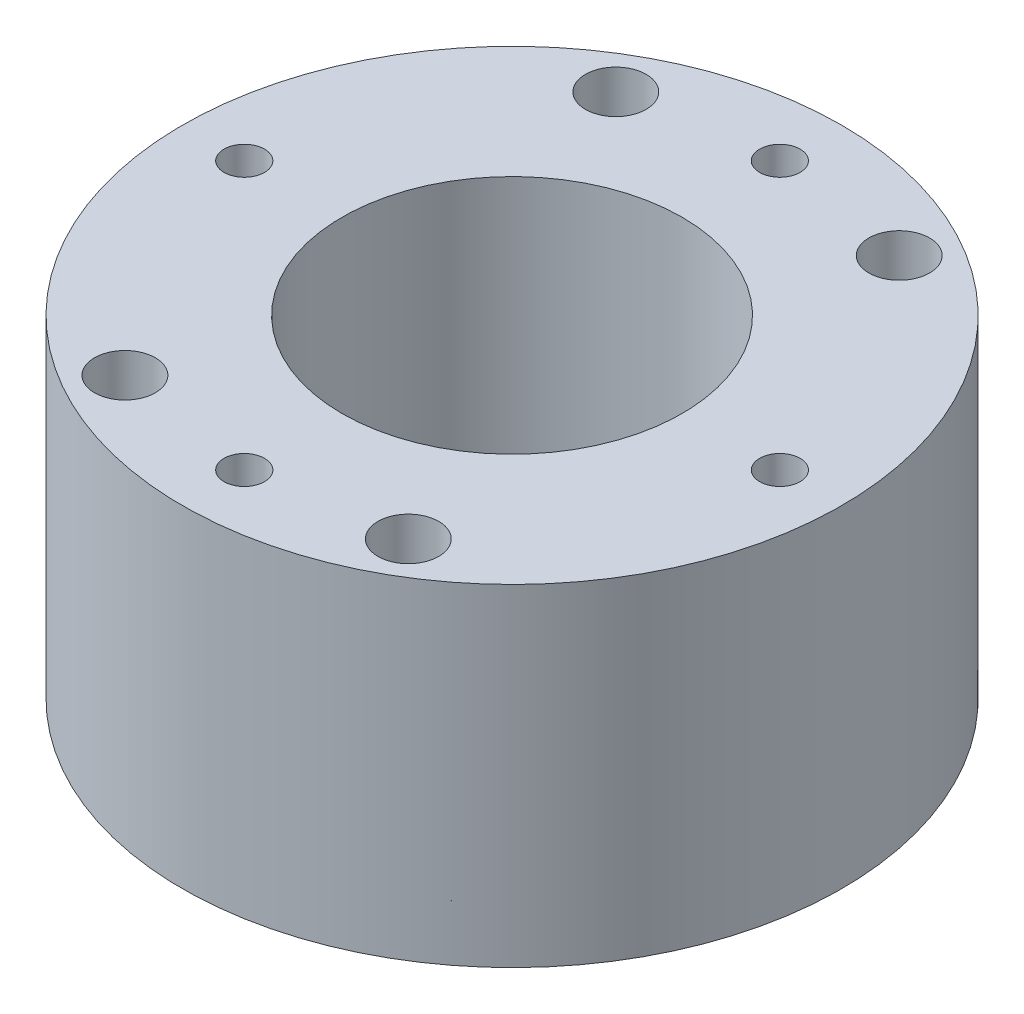
ISO-10303-21;
HEADER;
FILE_DESCRIPTION(('STEP AP214'),'2;1');
FILE_NAME('part.step','',(''),(''),'','','');
FILE_SCHEMA(('AUTOMOTIVE_DESIGN { 1 0 10303 214 1 1 1 1 }'));
ENDSEC;
DATA;
#1=APPLICATION_CONTEXT('core data for automotive mechanical design processes');
#2=APPLICATION_PROTOCOL_DEFINITION('international standard','automotive_design',2000,#1);
#3=PRODUCT_CONTEXT('',#1,'mechanical');
#4=PRODUCT('Part','Part','',(#3));
#5=PRODUCT_RELATED_PRODUCT_CATEGORY('part','',(#4));
#6=PRODUCT_DEFINITION_FORMATION('','',#4);
#7=PRODUCT_DEFINITION_CONTEXT('part definition',#1,'design');
#8=PRODUCT_DEFINITION('design','',#6,#7);
#9=PRODUCT_DEFINITION_SHAPE('','',#8);
#10=(LENGTH_UNIT() NAMED_UNIT(*) SI_UNIT(.MILLI.,.METRE.));
#11=(NAMED_UNIT(*) PLANE_ANGLE_UNIT() SI_UNIT($,.RADIAN.));
#12=(NAMED_UNIT(*) SI_UNIT($,.STERADIAN.) SOLID_ANGLE_UNIT());
#13=UNCERTAINTY_MEASURE_WITH_UNIT(LENGTH_MEASURE(1.E-05),#10,'distance_accuracy_value','');
#14=(GEOMETRIC_REPRESENTATION_CONTEXT(3) GLOBAL_UNCERTAINTY_ASSIGNED_CONTEXT((#13)) GLOBAL_UNIT_ASSIGNED_CONTEXT((#10,
#11,#12)) REPRESENTATION_CONTEXT('',''));
#15=CARTESIAN_POINT('',(0.,0.,0.));
#16=DIRECTION('',(0.,0.,1.));
#17=DIRECTION('',(1.,0.,0.));
#18=AXIS2_PLACEMENT_3D('',#15,#16,#17);
#19=CARTESIAN_POINT('',(0.,0.,0.));
#20=DIRECTION('',(0.,-1.,0.));
#21=DIRECTION('',(0.,0.,-1.));
#22=AXIS2_PLACEMENT_3D('',#19,#20,#21);
#23=CYLINDRICAL_SURFACE('',#22,14.2875);
#24=CARTESIAN_POINT('',(0.,0.,0.));
#25=DIRECTION('',(0.,-1.,0.));
#26=DIRECTION('',(0.,0.,-1.));
#27=AXIS2_PLACEMENT_3D('',#24,#25,#26);
#28=CIRCLE('',#27,14.2875);
#29=CARTESIAN_POINT('',(0.,0.,-14.2875));
#30=VERTEX_POINT('',#29);
#31=EDGE_CURVE('E60',#30,#30,#28,.T.);
#32=ORIENTED_EDGE('',*,*,#31,.T.);
#33=EDGE_LOOP('',(#32));
#34=FACE_BOUND('',#33,.T.);
#35=CARTESIAN_POINT('',(0.,27.8791,0.));
#36=DIRECTION('',(0.,-1.,0.));
#37=DIRECTION('',(0.,0.,-1.));
#38=AXIS2_PLACEMENT_3D('',#35,#36,#37);
#39=CIRCLE('',#38,14.2875);
#40=CARTESIAN_POINT('',(0.,27.8791,-14.2875));
#41=VERTEX_POINT('',#40);
#42=EDGE_CURVE('E10',#41,#41,#39,.T.);
#43=ORIENTED_EDGE('',*,*,#42,.F.);
#44=EDGE_LOOP('',(#43));
#45=FACE_BOUND('',#44,.T.);
#46=ADVANCED_FACE('F43',(#34,#45),#23,.F.);
#47=CARTESIAN_POINT('',(14.2875,27.8791,0.));
#48=DIRECTION('',(0.,1.,0.));
#49=DIRECTION('',(0.,0.,1.));
#50=AXIS2_PLACEMENT_3D('',#47,#48,#49);
#51=PLANE('',#50);
#52=CARTESIAN_POINT('',(-11.90625,27.8791,-20.6222299276169));
#53=DIRECTION('',(0.,1.,0.));
#54=DIRECTION('',(0.,0.,1.));
#55=AXIS2_PLACEMENT_3D('',#52,#53,#54);
#56=CIRCLE('',#55,2.55269999999999);
#57=CARTESIAN_POINT('',(-11.90625,27.8791,-18.069529927617));
#58=VERTEX_POINT('',#57);
#59=EDGE_CURVE('E154',#58,#58,#56,.T.);
#60=ORIENTED_EDGE('',*,*,#59,.F.);
#61=EDGE_LOOP('',(#60));
#62=FACE_BOUND('',#61,.T.);
#63=CARTESIAN_POINT('',(11.90625,27.8791,-20.6222299276169));
#64=DIRECTION('',(0.,1.,0.));
#65=DIRECTION('',(0.,0.,1.));
#66=AXIS2_PLACEMENT_3D('',#63,#64,#65);
#67=CIRCLE('',#66,2.5527);
#68=CARTESIAN_POINT('',(11.90625,27.8791,-18.069529927617));
#69=VERTEX_POINT('',#68);
#70=EDGE_CURVE('E146',#69,#69,#67,.T.);
#71=ORIENTED_EDGE('',*,*,#70,.F.);
#72=EDGE_LOOP('',(#71));
#73=FACE_BOUND('',#72,.T.);
#74=CARTESIAN_POINT('',(11.90625,27.8791,20.6222299276169));
#75=DIRECTION('',(0.,1.,0.));
#76=DIRECTION('',(0.,0.,1.));
#77=AXIS2_PLACEMENT_3D('',#74,#75,#76);
#78=CIRCLE('',#77,2.5527);
#79=CARTESIAN_POINT('',(11.90625,27.8791,23.1749299276169));
#80=VERTEX_POINT('',#79);
#81=EDGE_CURVE('E138',#80,#80,#78,.T.);
#82=ORIENTED_EDGE('',*,*,#81,.F.);
#83=EDGE_LOOP('',(#82));
#84=FACE_BOUND('',#83,.T.);
#85=CARTESIAN_POINT('',(-11.90625,27.8791,20.622229927617));
#86=DIRECTION('',(0.,1.,0.));
#87=DIRECTION('',(0.,0.,1.));
#88=AXIS2_PLACEMENT_3D('',#85,#86,#87);
#89=CIRCLE('',#88,2.5527);
#90=CARTESIAN_POINT('',(-11.90625,27.8791,23.174929927617));
#91=VERTEX_POINT('',#90);
#92=EDGE_CURVE('E130',#91,#91,#89,.T.);
#93=ORIENTED_EDGE('',*,*,#92,.F.);
#94=EDGE_LOOP('',(#93));
#95=FACE_BOUND('',#94,.T.);
#96=CARTESIAN_POINT('',(0.,27.8791,-22.5));
#97=DIRECTION('',(0.,1.,0.));
#98=DIRECTION('',(0.,0.,1.));
#99=AXIS2_PLACEMENT_3D('',#96,#97,#98);
#100=CIRCLE('',#99,1.7);
#101=CARTESIAN_POINT('',(0.,27.8791,-20.8));
#102=VERTEX_POINT('',#101);
#103=EDGE_CURVE('E114',#102,#102,#100,.T.);
#104=ORIENTED_EDGE('',*,*,#103,.F.);
#105=EDGE_LOOP('',(#104));
#106=FACE_BOUND('',#105,.T.);
#107=CARTESIAN_POINT('',(22.5,27.8791,0.));
#108=DIRECTION('',(0.,1.,0.));
#109=DIRECTION('',(0.,0.,1.));
#110=AXIS2_PLACEMENT_3D('',#107,#108,#109);
#111=CIRCLE('',#110,1.7);
#112=CARTESIAN_POINT('',(22.5,27.8791,1.7));
#113=VERTEX_POINT('',#112);
#114=EDGE_CURVE('E98',#113,#113,#111,.T.);
#115=ORIENTED_EDGE('',*,*,#114,.F.);
#116=EDGE_LOOP('',(#115));
#117=FACE_BOUND('',#116,.T.);
#118=CARTESIAN_POINT('',(-22.5,27.8791,0.));
#119=DIRECTION('',(0.,1.,0.));
#120=DIRECTION('',(0.,0.,1.));
#121=AXIS2_PLACEMENT_3D('',#118,#119,#120);
#122=CIRCLE('',#121,1.7);
#123=CARTESIAN_POINT('',(-22.5,27.8791,1.7));
#124=VERTEX_POINT('',#123);
#125=EDGE_CURVE('E82',#124,#124,#122,.T.);
#126=ORIENTED_EDGE('',*,*,#125,.F.);
#127=EDGE_LOOP('',(#126));
#128=FACE_BOUND('',#127,.T.);
#129=CARTESIAN_POINT('',(0.,27.8791,22.5));
#130=DIRECTION('',(0.,1.,0.));
#131=DIRECTION('',(0.,0.,1.));
#132=AXIS2_PLACEMENT_3D('',#129,#130,#131);
#133=CIRCLE('',#132,1.7);
#134=CARTESIAN_POINT('',(0.,27.8791,24.2));
#135=VERTEX_POINT('',#134);
#136=EDGE_CURVE('E66',#135,#135,#133,.T.);
#137=ORIENTED_EDGE('',*,*,#136,.F.);
#138=EDGE_LOOP('',(#137));
#139=FACE_BOUND('',#138,.T.);
#140=ORIENTED_EDGE('',*,*,#42,.T.);
#141=EDGE_LOOP('',(#140));
#142=FACE_BOUND('',#141,.T.);
#143=CARTESIAN_POINT('',(0.,27.8791,0.));
#144=DIRECTION('',(0.,-1.,0.));
#145=DIRECTION('',(0.,0.,-1.));
#146=AXIS2_PLACEMENT_3D('',#143,#144,#145);
#147=CIRCLE('',#146,27.69);
#148=CARTESIAN_POINT('',(0.,27.8791,-27.69));
#149=VERTEX_POINT('',#148);
#150=EDGE_CURVE('E50',#149,#149,#147,.T.);
#151=ORIENTED_EDGE('',*,*,#150,.F.);
#152=EDGE_LOOP('',(#151));
#153=FACE_BOUND('',#152,.T.);
#154=ADVANCED_FACE('F192',(#62,#73,#84,#95,#106,#117,#128,#139,#142,#153),#51,.T.);
#155=CARTESIAN_POINT('',(0.,0.,0.));
#156=DIRECTION('',(0.,-1.,0.));
#157=DIRECTION('',(0.,0.,-1.));
#158=AXIS2_PLACEMENT_3D('',#155,#156,#157);
#159=CYLINDRICAL_SURFACE('',#158,27.69);
#160=ORIENTED_EDGE('',*,*,#150,.T.);
#161=EDGE_LOOP('',(#160));
#162=FACE_BOUND('',#161,.T.);
#163=CARTESIAN_POINT('',(0.,0.,0.));
#164=DIRECTION('',(0.,-1.,0.));
#165=DIRECTION('',(0.,0.,-1.));
#166=AXIS2_PLACEMENT_3D('',#163,#164,#165);
#167=CIRCLE('',#166,27.69);
#168=CARTESIAN_POINT('',(0.,0.,-27.69));
#169=VERTEX_POINT('',#168);
#170=EDGE_CURVE('E55',#169,#169,#167,.T.);
#171=ORIENTED_EDGE('',*,*,#170,.F.);
#172=EDGE_LOOP('',(#171));
#173=FACE_BOUND('',#172,.T.);
#174=ADVANCED_FACE('F170',(#162,#173),#159,.T.);
#175=CARTESIAN_POINT('',(27.69,0.,0.));
#176=DIRECTION('',(0.,-1.,0.));
#177=DIRECTION('',(0.,0.,-1.));
#178=AXIS2_PLACEMENT_3D('',#175,#176,#177);
#179=PLANE('',#178);
#180=CARTESIAN_POINT('',(-11.90625,0.,-20.6222299276169));
#181=DIRECTION('',(0.,-1.,0.));
#182=DIRECTION('',(0.,0.,-1.));
#183=AXIS2_PLACEMENT_3D('',#180,#181,#182);
#184=CIRCLE('',#183,2.5527);
#185=CARTESIAN_POINT('',(-11.90625,0.,-23.1749299276169));
#186=VERTEX_POINT('',#185);
#187=EDGE_CURVE('E158',#186,#186,#184,.T.);
#188=ORIENTED_EDGE('',*,*,#187,.F.);
#189=EDGE_LOOP('',(#188));
#190=FACE_BOUND('',#189,.T.);
#191=CARTESIAN_POINT('',(11.90625,0.,-20.6222299276169));
#192=DIRECTION('',(0.,-1.,0.));
#193=DIRECTION('',(0.,0.,-1.));
#194=AXIS2_PLACEMENT_3D('',#191,#192,#193);
#195=CIRCLE('',#194,2.5527);
#196=CARTESIAN_POINT('',(11.90625,0.,-23.1749299276169));
#197=VERTEX_POINT('',#196);
#198=EDGE_CURVE('E150',#197,#197,#195,.T.);
#199=ORIENTED_EDGE('',*,*,#198,.F.);
#200=EDGE_LOOP('',(#199));
#201=FACE_BOUND('',#200,.T.);
#202=CARTESIAN_POINT('',(11.90625,0.,20.6222299276169));
#203=DIRECTION('',(0.,-1.,0.));
#204=DIRECTION('',(0.,0.,-1.));
#205=AXIS2_PLACEMENT_3D('',#202,#203,#204);
#206=CIRCLE('',#205,2.5527);
#207=CARTESIAN_POINT('',(11.90625,0.,18.0695299276169));
#208=VERTEX_POINT('',#207);
#209=EDGE_CURVE('E142',#208,#208,#206,.T.);
#210=ORIENTED_EDGE('',*,*,#209,.F.);
#211=EDGE_LOOP('',(#210));
#212=FACE_BOUND('',#211,.T.);
#213=CARTESIAN_POINT('',(-11.90625,0.,20.622229927617));
#214=DIRECTION('',(0.,-1.,0.));
#215=DIRECTION('',(0.,0.,-1.));
#216=AXIS2_PLACEMENT_3D('',#213,#214,#215);
#217=CIRCLE('',#216,2.5527);
#218=CARTESIAN_POINT('',(-11.90625,0.,18.069529927617));
#219=VERTEX_POINT('',#218);
#220=EDGE_CURVE('E134',#219,#219,#217,.T.);
#221=ORIENTED_EDGE('',*,*,#220,.F.);
#222=EDGE_LOOP('',(#221));
#223=FACE_BOUND('',#222,.T.);
#224=CARTESIAN_POINT('',(0.,0.,-22.5));
#225=DIRECTION('',(0.,-1.,0.));
#226=DIRECTION('',(0.,0.,-1.));
#227=AXIS2_PLACEMENT_3D('',#224,#225,#226);
#228=CIRCLE('',#227,3.35);
#229=CARTESIAN_POINT('',(0.,0.,-25.85));
#230=VERTEX_POINT('',#229);
#231=EDGE_CURVE('E126',#230,#230,#228,.T.);
#232=ORIENTED_EDGE('',*,*,#231,.F.);
#233=EDGE_LOOP('',(#232));
#234=FACE_BOUND('',#233,.T.);
#235=CARTESIAN_POINT('',(22.5,0.,0.));
#236=DIRECTION('',(0.,-1.,0.));
#237=DIRECTION('',(0.,0.,-1.));
#238=AXIS2_PLACEMENT_3D('',#235,#236,#237);
#239=CIRCLE('',#238,3.35);
#240=CARTESIAN_POINT('',(22.5,0.,-3.35));
#241=VERTEX_POINT('',#240);
#242=EDGE_CURVE('E110',#241,#241,#239,.T.);
#243=ORIENTED_EDGE('',*,*,#242,.F.);
#244=EDGE_LOOP('',(#243));
#245=FACE_BOUND('',#244,.T.);
#246=CARTESIAN_POINT('',(-22.5,0.,0.));
#247=DIRECTION('',(0.,-1.,0.));
#248=DIRECTION('',(0.,0.,-1.));
#249=AXIS2_PLACEMENT_3D('',#246,#247,#248);
#250=CIRCLE('',#249,3.35);
#251=CARTESIAN_POINT('',(-22.5,0.,-3.35));
#252=VERTEX_POINT('',#251);
#253=EDGE_CURVE('E94',#252,#252,#250,.T.);
#254=ORIENTED_EDGE('',*,*,#253,.F.);
#255=EDGE_LOOP('',(#254));
#256=FACE_BOUND('',#255,.T.);
#257=CARTESIAN_POINT('',(0.,0.,22.5));
#258=DIRECTION('',(0.,-1.,0.));
#259=DIRECTION('',(0.,0.,-1.));
#260=AXIS2_PLACEMENT_3D('',#257,#258,#259);
#261=CIRCLE('',#260,3.35);
#262=CARTESIAN_POINT('',(0.,0.,19.15));
#263=VERTEX_POINT('',#262);
#264=EDGE_CURVE('E78',#263,#263,#261,.T.);
#265=ORIENTED_EDGE('',*,*,#264,.F.);
#266=EDGE_LOOP('',(#265));
#267=FACE_BOUND('',#266,.T.);
#268=ORIENTED_EDGE('',*,*,#170,.T.);
#269=EDGE_LOOP('',(#268));
#270=FACE_BOUND('',#269,.T.);
#271=ORIENTED_EDGE('',*,*,#31,.F.);
#272=EDGE_LOOP('',(#271));
#273=FACE_BOUND('',#272,.T.);
#274=ADVANCED_FACE('F166',(#190,#201,#212,#223,#234,#245,#256,#267,#270,#273),#179,.T.);
#275=CARTESIAN_POINT('',(0.,0.,22.5));
#276=DIRECTION('',(0.,-1.,0.));
#277=DIRECTION('',(0.,0.,-1.));
#278=AXIS2_PLACEMENT_3D('',#275,#276,#277);
#279=CYLINDRICAL_SURFACE('',#278,1.7);
#280=CARTESIAN_POINT('',(0.,2.15,22.5));
#281=DIRECTION('',(0.,-1.,0.));
#282=DIRECTION('',(0.,0.,-1.));
#283=AXIS2_PLACEMENT_3D('',#280,#281,#282);
#284=CIRCLE('',#283,1.7);
#285=CARTESIAN_POINT('',(0.,2.15,20.8));
#286=VERTEX_POINT('',#285);
#287=EDGE_CURVE('E70',#286,#286,#284,.T.);
#288=ORIENTED_EDGE('',*,*,#287,.T.);
#289=EDGE_LOOP('',(#288));
#290=FACE_BOUND('',#289,.T.);
#291=ORIENTED_EDGE('',*,*,#136,.T.);
#292=EDGE_LOOP('',(#291));
#293=FACE_BOUND('',#292,.T.);
#294=ADVANCED_FACE('F169',(#290,#293),#279,.F.);
#295=CARTESIAN_POINT('',(1.7,2.15,22.5));
#296=DIRECTION('',(0.,1.,0.));
#297=DIRECTION('',(0.,0.,1.));
#298=AXIS2_PLACEMENT_3D('',#295,#296,#297);
#299=PLANE('',#298);
#300=ORIENTED_EDGE('',*,*,#287,.F.);
#301=EDGE_LOOP('',(#300));
#302=FACE_BOUND('',#301,.T.);
#303=CARTESIAN_POINT('',(0.,2.15,22.5));
#304=DIRECTION('',(0.,-1.,0.));
#305=DIRECTION('',(0.,0.,-1.));
#306=AXIS2_PLACEMENT_3D('',#303,#304,#305);
#307=CIRCLE('',#306,3.35);
#308=CARTESIAN_POINT('',(0.,2.15,19.15));
#309=VERTEX_POINT('',#308);
#310=EDGE_CURVE('E74',#309,#309,#307,.T.);
#311=ORIENTED_EDGE('',*,*,#310,.T.);
#312=EDGE_LOOP('',(#311));
#313=FACE_BOUND('',#312,.T.);
#314=ADVANCED_FACE('F207',(#302,#313),#299,.F.);
#315=CARTESIAN_POINT('',(0.,0.,22.5));
#316=DIRECTION('',(0.,-1.,0.));
#317=DIRECTION('',(0.,0.,-1.));
#318=AXIS2_PLACEMENT_3D('',#315,#316,#317);
#319=CYLINDRICAL_SURFACE('',#318,3.35);
#320=ORIENTED_EDGE('',*,*,#310,.F.);
#321=EDGE_LOOP('',(#320));
#322=FACE_BOUND('',#321,.T.);
#323=ORIENTED_EDGE('',*,*,#264,.T.);
#324=EDGE_LOOP('',(#323));
#325=FACE_BOUND('',#324,.T.);
#326=ADVANCED_FACE('F211',(#322,#325),#319,.F.);
#327=CARTESIAN_POINT('',(-22.5,0.,0.));
#328=DIRECTION('',(0.,-1.,0.));
#329=DIRECTION('',(0.,0.,-1.));
#330=AXIS2_PLACEMENT_3D('',#327,#328,#329);
#331=CYLINDRICAL_SURFACE('',#330,1.7);
#332=CARTESIAN_POINT('',(-22.5,2.15,0.));
#333=DIRECTION('',(0.,-1.,0.));
#334=DIRECTION('',(0.,0.,-1.));
#335=AXIS2_PLACEMENT_3D('',#332,#333,#334);
#336=CIRCLE('',#335,1.7);
#337=CARTESIAN_POINT('',(-22.5,2.15,-1.7));
#338=VERTEX_POINT('',#337);
#339=EDGE_CURVE('E86',#338,#338,#336,.T.);
#340=ORIENTED_EDGE('',*,*,#339,.T.);
#341=EDGE_LOOP('',(#340));
#342=FACE_BOUND('',#341,.T.);
#343=ORIENTED_EDGE('',*,*,#125,.T.);
#344=EDGE_LOOP('',(#343));
#345=FACE_BOUND('',#344,.T.);
#346=ADVANCED_FACE('F215',(#342,#345),#331,.F.);
#347=CARTESIAN_POINT('',(-20.8,2.15,0.));
#348=DIRECTION('',(0.,1.,0.));
#349=DIRECTION('',(0.,0.,1.));
#350=AXIS2_PLACEMENT_3D('',#347,#348,#349);
#351=PLANE('',#350);
#352=ORIENTED_EDGE('',*,*,#339,.F.);
#353=EDGE_LOOP('',(#352));
#354=FACE_BOUND('',#353,.T.);
#355=CARTESIAN_POINT('',(-22.5,2.15,0.));
#356=DIRECTION('',(0.,-1.,0.));
#357=DIRECTION('',(0.,0.,-1.));
#358=AXIS2_PLACEMENT_3D('',#355,#356,#357);
#359=CIRCLE('',#358,3.35);
#360=CARTESIAN_POINT('',(-22.5,2.15,-3.35));
#361=VERTEX_POINT('',#360);
#362=EDGE_CURVE('E90',#361,#361,#359,.T.);
#363=ORIENTED_EDGE('',*,*,#362,.T.);
#364=EDGE_LOOP('',(#363));
#365=FACE_BOUND('',#364,.T.);
#366=ADVANCED_FACE('F219',(#354,#365),#351,.F.);
#367=CARTESIAN_POINT('',(-22.5,0.,0.));
#368=DIRECTION('',(0.,-1.,0.));
#369=DIRECTION('',(0.,0.,-1.));
#370=AXIS2_PLACEMENT_3D('',#367,#368,#369);
#371=CYLINDRICAL_SURFACE('',#370,3.35);
#372=ORIENTED_EDGE('',*,*,#362,.F.);
#373=EDGE_LOOP('',(#372));
#374=FACE_BOUND('',#373,.T.);
#375=ORIENTED_EDGE('',*,*,#253,.T.);
#376=EDGE_LOOP('',(#375));
#377=FACE_BOUND('',#376,.T.);
#378=ADVANCED_FACE('F223',(#374,#377),#371,.F.);
#379=CARTESIAN_POINT('',(22.5,0.,0.));
#380=DIRECTION('',(0.,-1.,0.));
#381=DIRECTION('',(0.,0.,-1.));
#382=AXIS2_PLACEMENT_3D('',#379,#380,#381);
#383=CYLINDRICAL_SURFACE('',#382,1.7);
#384=CARTESIAN_POINT('',(22.5,2.15,0.));
#385=DIRECTION('',(0.,-1.,0.));
#386=DIRECTION('',(0.,0.,-1.));
#387=AXIS2_PLACEMENT_3D('',#384,#385,#386);
#388=CIRCLE('',#387,1.7);
#389=CARTESIAN_POINT('',(22.5,2.15,-1.7));
#390=VERTEX_POINT('',#389);
#391=EDGE_CURVE('E102',#390,#390,#388,.T.);
#392=ORIENTED_EDGE('',*,*,#391,.T.);
#393=EDGE_LOOP('',(#392));
#394=FACE_BOUND('',#393,.T.);
#395=ORIENTED_EDGE('',*,*,#114,.T.);
#396=EDGE_LOOP('',(#395));
#397=FACE_BOUND('',#396,.T.);
#398=ADVANCED_FACE('F227',(#394,#397),#383,.F.);
#399=CARTESIAN_POINT('',(24.2,2.15,0.));
#400=DIRECTION('',(0.,1.,0.));
#401=DIRECTION('',(0.,0.,1.));
#402=AXIS2_PLACEMENT_3D('',#399,#400,#401);
#403=PLANE('',#402);
#404=ORIENTED_EDGE('',*,*,#391,.F.);
#405=EDGE_LOOP('',(#404));
#406=FACE_BOUND('',#405,.T.);
#407=CARTESIAN_POINT('',(22.5,2.15,0.));
#408=DIRECTION('',(0.,-1.,0.));
#409=DIRECTION('',(0.,0.,-1.));
#410=AXIS2_PLACEMENT_3D('',#407,#408,#409);
#411=CIRCLE('',#410,3.35);
#412=CARTESIAN_POINT('',(22.5,2.15,-3.35));
#413=VERTEX_POINT('',#412);
#414=EDGE_CURVE('E106',#413,#413,#411,.T.);
#415=ORIENTED_EDGE('',*,*,#414,.T.);
#416=EDGE_LOOP('',(#415));
#417=FACE_BOUND('',#416,.T.);
#418=ADVANCED_FACE('F231',(#406,#417),#403,.F.);
#419=CARTESIAN_POINT('',(22.5,0.,0.));
#420=DIRECTION('',(0.,-1.,0.));
#421=DIRECTION('',(0.,0.,-1.));
#422=AXIS2_PLACEMENT_3D('',#419,#420,#421);
#423=CYLINDRICAL_SURFACE('',#422,3.35);
#424=ORIENTED_EDGE('',*,*,#414,.F.);
#425=EDGE_LOOP('',(#424));
#426=FACE_BOUND('',#425,.T.);
#427=ORIENTED_EDGE('',*,*,#242,.T.);
#428=EDGE_LOOP('',(#427));
#429=FACE_BOUND('',#428,.T.);
#430=ADVANCED_FACE('F235',(#426,#429),#423,.F.);
#431=CARTESIAN_POINT('',(0.,0.,-22.5));
#432=DIRECTION('',(0.,-1.,0.));
#433=DIRECTION('',(0.,0.,-1.));
#434=AXIS2_PLACEMENT_3D('',#431,#432,#433);
#435=CYLINDRICAL_SURFACE('',#434,1.7);
#436=CARTESIAN_POINT('',(0.,2.15,-22.5));
#437=DIRECTION('',(0.,-1.,0.));
#438=DIRECTION('',(0.,0.,-1.));
#439=AXIS2_PLACEMENT_3D('',#436,#437,#438);
#440=CIRCLE('',#439,1.7);
#441=CARTESIAN_POINT('',(0.,2.15,-24.2));
#442=VERTEX_POINT('',#441);
#443=EDGE_CURVE('E118',#442,#442,#440,.T.);
#444=ORIENTED_EDGE('',*,*,#443,.T.);
#445=EDGE_LOOP('',(#444));
#446=FACE_BOUND('',#445,.T.);
#447=ORIENTED_EDGE('',*,*,#103,.T.);
#448=EDGE_LOOP('',(#447));
#449=FACE_BOUND('',#448,.T.);
#450=ADVANCED_FACE('F239',(#446,#449),#435,.F.);
#451=CARTESIAN_POINT('',(1.7,2.15,-22.5));
#452=DIRECTION('',(0.,1.,0.));
#453=DIRECTION('',(0.,0.,1.));
#454=AXIS2_PLACEMENT_3D('',#451,#452,#453);
#455=PLANE('',#454);
#456=ORIENTED_EDGE('',*,*,#443,.F.);
#457=EDGE_LOOP('',(#456));
#458=FACE_BOUND('',#457,.T.);
#459=CARTESIAN_POINT('',(0.,2.15,-22.5));
#460=DIRECTION('',(0.,-1.,0.));
#461=DIRECTION('',(0.,0.,-1.));
#462=AXIS2_PLACEMENT_3D('',#459,#460,#461);
#463=CIRCLE('',#462,3.35);
#464=CARTESIAN_POINT('',(0.,2.15,-25.85));
#465=VERTEX_POINT('',#464);
#466=EDGE_CURVE('E122',#465,#465,#463,.T.);
#467=ORIENTED_EDGE('',*,*,#466,.T.);
#468=EDGE_LOOP('',(#467));
#469=FACE_BOUND('',#468,.T.);
#470=ADVANCED_FACE('F243',(#458,#469),#455,.F.);
#471=CARTESIAN_POINT('',(0.,0.,-22.5));
#472=DIRECTION('',(0.,-1.,0.));
#473=DIRECTION('',(0.,0.,-1.));
#474=AXIS2_PLACEMENT_3D('',#471,#472,#473);
#475=CYLINDRICAL_SURFACE('',#474,3.35);
#476=ORIENTED_EDGE('',*,*,#466,.F.);
#477=EDGE_LOOP('',(#476));
#478=FACE_BOUND('',#477,.T.);
#479=ORIENTED_EDGE('',*,*,#231,.T.);
#480=EDGE_LOOP('',(#479));
#481=FACE_BOUND('',#480,.T.);
#482=ADVANCED_FACE('F247',(#478,#481),#475,.F.);
#483=CARTESIAN_POINT('',(-11.90625,0.,20.622229927617));
#484=DIRECTION('',(0.,-1.,0.));
#485=DIRECTION('',(0.,0.,-1.));
#486=AXIS2_PLACEMENT_3D('',#483,#484,#485);
#487=CYLINDRICAL_SURFACE('',#486,2.5527);
#488=ORIENTED_EDGE('',*,*,#220,.T.);
#489=EDGE_LOOP('',(#488));
#490=FACE_BOUND('',#489,.T.);
#491=ORIENTED_EDGE('',*,*,#92,.T.);
#492=EDGE_LOOP('',(#491));
#493=FACE_BOUND('',#492,.T.);
#494=ADVANCED_FACE('F250',(#490,#493),#487,.F.);
#495=CARTESIAN_POINT('',(11.90625,0.,20.6222299276169));
#496=DIRECTION('',(0.,-1.,0.));
#497=DIRECTION('',(0.,0.,-1.));
#498=AXIS2_PLACEMENT_3D('',#495,#496,#497);
#499=CYLINDRICAL_SURFACE('',#498,2.5527);
#500=ORIENTED_EDGE('',*,*,#209,.T.);
#501=EDGE_LOOP('',(#500));
#502=FACE_BOUND('',#501,.T.);
#503=ORIENTED_EDGE('',*,*,#81,.T.);
#504=EDGE_LOOP('',(#503));
#505=FACE_BOUND('',#504,.T.);
#506=ADVANCED_FACE('F254',(#502,#505),#499,.F.);
#507=CARTESIAN_POINT('',(11.90625,0.,-20.6222299276169));
#508=DIRECTION('',(0.,-1.,0.));
#509=DIRECTION('',(0.,0.,-1.));
#510=AXIS2_PLACEMENT_3D('',#507,#508,#509);
#511=CYLINDRICAL_SURFACE('',#510,2.5527);
#512=ORIENTED_EDGE('',*,*,#198,.T.);
#513=EDGE_LOOP('',(#512));
#514=FACE_BOUND('',#513,.T.);
#515=ORIENTED_EDGE('',*,*,#70,.T.);
#516=EDGE_LOOP('',(#515));
#517=FACE_BOUND('',#516,.T.);
#518=ADVANCED_FACE('F258',(#514,#517),#511,.F.);
#519=CARTESIAN_POINT('',(-11.90625,0.,-20.6222299276169));
#520=DIRECTION('',(0.,-1.,0.));
#521=DIRECTION('',(0.,0.,-1.));
#522=AXIS2_PLACEMENT_3D('',#519,#520,#521);
#523=CYLINDRICAL_SURFACE('',#522,2.55269999999999);
#524=ORIENTED_EDGE('',*,*,#187,.T.);
#525=EDGE_LOOP('',(#524));
#526=FACE_BOUND('',#525,.T.);
#527=ORIENTED_EDGE('',*,*,#59,.T.);
#528=EDGE_LOOP('',(#527));
#529=FACE_BOUND('',#528,.T.);
#530=ADVANCED_FACE('F163',(#526,#529),#523,.F.);
#531=CLOSED_SHELL('',(#46,#154,#174,#274,#294,#314,#326,#346,#366,#378,#398,#418,#430,#450,#470,
#482,#494,#506,#518,#530));
#532=MANIFOLD_SOLID_BREP('B2',#531);
#533=ADVANCED_BREP_SHAPE_REPRESENTATION('',(#18,#532),#14);
#534=SHAPE_DEFINITION_REPRESENTATION(#9,#533);
ENDSEC;
END-ISO-10303-21;
